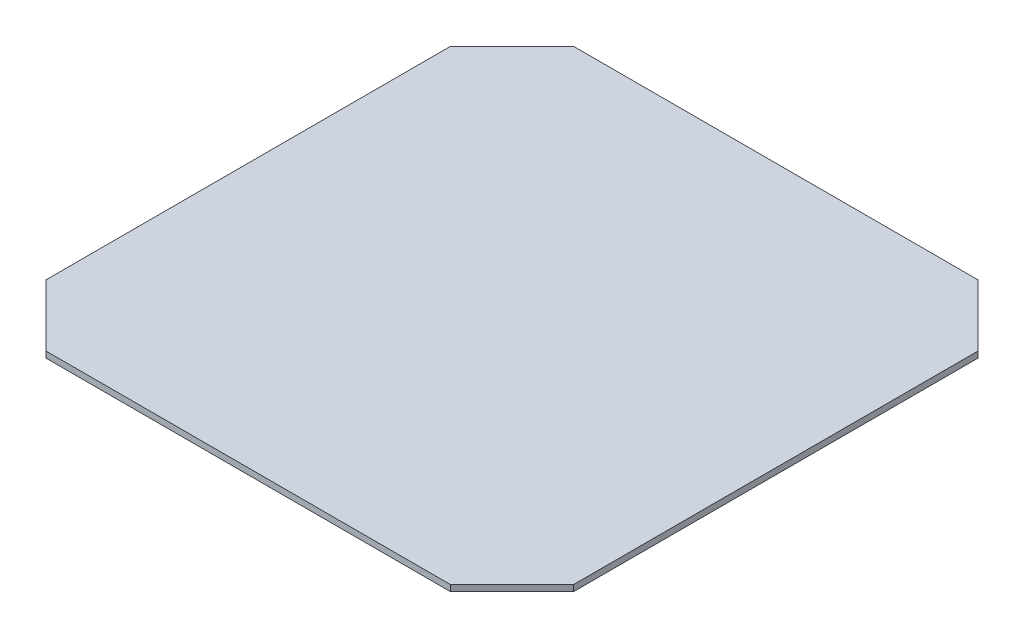
ISO-10303-21;
HEADER;
FILE_DESCRIPTION(('STEP AP214'),'2;1');
FILE_NAME('part.step','',(''),(''),'','','');
FILE_SCHEMA(('AUTOMOTIVE_DESIGN { 1 0 10303 214 1 1 1 1 }'));
ENDSEC;
DATA;
#1=APPLICATION_CONTEXT('core data for automotive mechanical design processes');
#2=APPLICATION_PROTOCOL_DEFINITION('international standard','automotive_design',2000,#1);
#3=PRODUCT_CONTEXT('',#1,'mechanical');
#4=PRODUCT('Part','Part','',(#3));
#5=PRODUCT_RELATED_PRODUCT_CATEGORY('part','',(#4));
#6=PRODUCT_DEFINITION_FORMATION('','',#4);
#7=PRODUCT_DEFINITION_CONTEXT('part definition',#1,'design');
#8=PRODUCT_DEFINITION('design','',#6,#7);
#9=PRODUCT_DEFINITION_SHAPE('','',#8);
#10=(LENGTH_UNIT() NAMED_UNIT(*) SI_UNIT(.MILLI.,.METRE.));
#11=(NAMED_UNIT(*) PLANE_ANGLE_UNIT() SI_UNIT($,.RADIAN.));
#12=(NAMED_UNIT(*) SI_UNIT($,.STERADIAN.) SOLID_ANGLE_UNIT());
#13=UNCERTAINTY_MEASURE_WITH_UNIT(LENGTH_MEASURE(1.E-05),#10,'distance_accuracy_value','');
#14=(GEOMETRIC_REPRESENTATION_CONTEXT(3) GLOBAL_UNCERTAINTY_ASSIGNED_CONTEXT((#13)) GLOBAL_UNIT_ASSIGNED_CONTEXT((#10,
#11,#12)) REPRESENTATION_CONTEXT('',''));
#15=CARTESIAN_POINT('',(0.,0.,0.));
#16=DIRECTION('',(0.,0.,1.));
#17=DIRECTION('',(1.,0.,0.));
#18=AXIS2_PLACEMENT_3D('',#15,#16,#17);
#19=CARTESIAN_POINT('',(0.,1.25,0.));
#20=DIRECTION('',(0.,1.,0.));
#21=DIRECTION('',(0.,0.,1.));
#22=AXIS2_PLACEMENT_3D('',#19,#20,#21);
#23=PLANE('',#22);
#24=DIRECTION('',(0.,0.,1.));
#25=VECTOR('',#24,1.);
#26=CARTESIAN_POINT('',(-107.,1.25,-107.));
#27=LINE('',#26,#25);
#28=CARTESIAN_POINT('',(-107.,1.25,-82.0000000000001));
#29=VERTEX_POINT('',#28);
#30=CARTESIAN_POINT('',(-107.,1.25,81.9999999999998));
#31=VERTEX_POINT('',#30);
#32=EDGE_CURVE('E165',#29,#31,#27,.T.);
#33=ORIENTED_EDGE('',*,*,#32,.T.);
#34=DIRECTION('',(-0.707106781186546,0.,-0.707106781186549));
#35=VECTOR('',#34,1.);
#36=CARTESIAN_POINT('',(-94.5000000000001,1.25,94.4999999999998));
#37=LINE('',#36,#35);
#38=CARTESIAN_POINT('',(-81.9999999999999,1.25,107.));
#39=VERTEX_POINT('',#38);
#40=EDGE_CURVE('E146',#31,#39,#37,.F.);
#41=ORIENTED_EDGE('',*,*,#40,.T.);
#42=DIRECTION('',(1.,0.,0.));
#43=VECTOR('',#42,1.);
#44=CARTESIAN_POINT('',(-107.,1.25,107.));
#45=LINE('',#44,#43);
#46=CARTESIAN_POINT('',(81.9999999999999,1.25,107.));
#47=VERTEX_POINT('',#46);
#48=EDGE_CURVE('E118',#39,#47,#45,.T.);
#49=ORIENTED_EDGE('',*,*,#48,.T.);
#50=DIRECTION('',(-0.707106781186548,0.,0.707106781186547));
#51=VECTOR('',#50,1.);
#52=CARTESIAN_POINT('',(94.4999999999998,1.25,94.5000000000001));
#53=LINE('',#52,#51);
#54=CARTESIAN_POINT('',(107.,1.25,82.));
#55=VERTEX_POINT('',#54);
#56=EDGE_CURVE('E144',#47,#55,#53,.F.);
#57=ORIENTED_EDGE('',*,*,#56,.T.);
#58=DIRECTION('',(0.,0.,-1.));
#59=VECTOR('',#58,1.);
#60=CARTESIAN_POINT('',(107.,1.25,-107.));
#61=LINE('',#60,#59);
#62=CARTESIAN_POINT('',(107.,1.25,-81.9999999999998));
#63=VERTEX_POINT('',#62);
#64=EDGE_CURVE('E124',#55,#63,#61,.T.);
#65=ORIENTED_EDGE('',*,*,#64,.T.);
#66=DIRECTION('',(0.707106781186546,0.,0.707106781186549));
#67=VECTOR('',#66,1.);
#68=CARTESIAN_POINT('',(94.5000000000001,1.25,-94.4999999999998));
#69=LINE('',#68,#67);
#70=CARTESIAN_POINT('',(81.9999999999999,1.25,-107.));
#71=VERTEX_POINT('',#70);
#72=EDGE_CURVE('E53',#63,#71,#69,.F.);
#73=ORIENTED_EDGE('',*,*,#72,.T.);
#74=DIRECTION('',(-1.,0.,0.));
#75=VECTOR('',#74,1.);
#76=CARTESIAN_POINT('',(-107.,1.25,-107.));
#77=LINE('',#76,#75);
#78=CARTESIAN_POINT('',(-82.,1.25,-107.));
#79=VERTEX_POINT('',#78);
#80=EDGE_CURVE('E127',#71,#79,#77,.T.);
#81=ORIENTED_EDGE('',*,*,#80,.T.);
#82=DIRECTION('',(0.707106781186549,0.,-0.707106781186546));
#83=VECTOR('',#82,1.);
#84=CARTESIAN_POINT('',(-94.4999999999999,1.25,-94.5000000000002));
#85=LINE('',#84,#83);
#86=EDGE_CURVE('E141',#79,#29,#85,.F.);
#87=ORIENTED_EDGE('',*,*,#86,.T.);
#88=EDGE_LOOP('',(#33,#41,#49,#57,#65,#73,#81,#87));
#89=FACE_BOUND('',#88,.T.);
#90=ADVANCED_FACE('F32',(#89),#23,.T.);
#91=CARTESIAN_POINT('',(0.,-1.25,0.));
#92=DIRECTION('',(0.,1.,0.));
#93=DIRECTION('',(0.,0.,1.));
#94=AXIS2_PLACEMENT_3D('',#91,#92,#93);
#95=PLANE('',#94);
#96=DIRECTION('',(1.,0.,0.));
#97=VECTOR('',#96,1.);
#98=CARTESIAN_POINT('',(-107.,-1.25,107.));
#99=LINE('',#98,#97);
#100=CARTESIAN_POINT('',(-81.9999999999999,-1.25,107.));
#101=VERTEX_POINT('',#100);
#102=CARTESIAN_POINT('',(81.9999999999999,-1.25,107.));
#103=VERTEX_POINT('',#102);
#104=EDGE_CURVE('E115',#101,#103,#99,.T.);
#105=ORIENTED_EDGE('',*,*,#104,.F.);
#106=DIRECTION('',(0.707106781186546,0.,0.707106781186549));
#107=VECTOR('',#106,1.);
#108=CARTESIAN_POINT('',(-81.9999999999999,-1.25,107.));
#109=LINE('',#108,#107);
#110=CARTESIAN_POINT('',(-107.,-1.25,81.9999999999998));
#111=VERTEX_POINT('',#110);
#112=EDGE_CURVE('E98',#101,#111,#109,.F.);
#113=ORIENTED_EDGE('',*,*,#112,.T.);
#114=DIRECTION('',(0.,0.,1.));
#115=VECTOR('',#114,1.);
#116=CARTESIAN_POINT('',(-107.,-1.25,-107.));
#117=LINE('',#116,#115);
#118=CARTESIAN_POINT('',(-107.,-1.25,-82.0000000000001));
#119=VERTEX_POINT('',#118);
#120=EDGE_CURVE('E125',#119,#111,#117,.T.);
#121=ORIENTED_EDGE('',*,*,#120,.F.);
#122=DIRECTION('',(-0.707106781186549,0.,0.707106781186546));
#123=VECTOR('',#122,1.);
#124=CARTESIAN_POINT('',(-107.,-1.25,-82.0000000000001));
#125=LINE('',#124,#123);
#126=CARTESIAN_POINT('',(-82.,-1.25,-107.));
#127=VERTEX_POINT('',#126);
#128=EDGE_CURVE('E119',#119,#127,#125,.F.);
#129=ORIENTED_EDGE('',*,*,#128,.T.);
#130=DIRECTION('',(-1.,0.,0.));
#131=VECTOR('',#130,1.);
#132=CARTESIAN_POINT('',(-107.,-1.25,-107.));
#133=LINE('',#132,#131);
#134=CARTESIAN_POINT('',(81.9999999999999,-1.25,-107.));
#135=VERTEX_POINT('',#134);
#136=EDGE_CURVE('E129',#135,#127,#133,.T.);
#137=ORIENTED_EDGE('',*,*,#136,.F.);
#138=DIRECTION('',(-0.707106781186546,0.,-0.707106781186549));
#139=VECTOR('',#138,1.);
#140=CARTESIAN_POINT('',(81.9999999999999,-1.25,-107.));
#141=LINE('',#140,#139);
#142=CARTESIAN_POINT('',(107.,-1.25,-81.9999999999998));
#143=VERTEX_POINT('',#142);
#144=EDGE_CURVE('E135',#135,#143,#141,.F.);
#145=ORIENTED_EDGE('',*,*,#144,.T.);
#146=DIRECTION('',(0.,0.,-1.));
#147=VECTOR('',#146,1.);
#148=CARTESIAN_POINT('',(107.,-1.25,-107.));
#149=LINE('',#148,#147);
#150=CARTESIAN_POINT('',(107.,-1.25,82.));
#151=VERTEX_POINT('',#150);
#152=EDGE_CURVE('E157',#151,#143,#149,.T.);
#153=ORIENTED_EDGE('',*,*,#152,.F.);
#154=DIRECTION('',(0.707106781186548,0.,-0.707106781186547));
#155=VECTOR('',#154,1.);
#156=CARTESIAN_POINT('',(107.,-1.25,81.9999999999999));
#157=LINE('',#156,#155);
#158=EDGE_CURVE('E109',#151,#103,#157,.F.);
#159=ORIENTED_EDGE('',*,*,#158,.T.);
#160=EDGE_LOOP('',(#105,#113,#121,#129,#137,#145,#153,#159));
#161=FACE_BOUND('',#160,.T.);
#162=ADVANCED_FACE('F122',(#161),#95,.F.);
#163=CARTESIAN_POINT('',(107.,1.25,-107.));
#164=DIRECTION('',(-1.,0.,0.));
#165=DIRECTION('',(0.,0.,1.));
#166=AXIS2_PLACEMENT_3D('',#163,#164,#165);
#167=PLANE('',#166);
#168=ORIENTED_EDGE('',*,*,#64,.F.);
#169=DIRECTION('',(0.,-1.,0.));
#170=VECTOR('',#169,1.);
#171=CARTESIAN_POINT('',(107.,1.25,81.9999999999999));
#172=LINE('',#171,#170);
#173=EDGE_CURVE('E150',#55,#151,#172,.T.);
#174=ORIENTED_EDGE('',*,*,#173,.T.);
#175=ORIENTED_EDGE('',*,*,#152,.T.);
#176=DIRECTION('',(0.,1.,0.));
#177=VECTOR('',#176,1.);
#178=CARTESIAN_POINT('',(107.,1.25,-81.9999999999998));
#179=LINE('',#178,#177);
#180=EDGE_CURVE('E148',#143,#63,#179,.T.);
#181=ORIENTED_EDGE('',*,*,#180,.T.);
#182=EDGE_LOOP('',(#168,#174,#175,#181));
#183=FACE_BOUND('',#182,.T.);
#184=ADVANCED_FACE('F156',(#183),#167,.F.);
#185=CARTESIAN_POINT('',(-107.,1.25,-107.));
#186=DIRECTION('',(0.,0.,1.));
#187=DIRECTION('',(1.,0.,0.));
#188=AXIS2_PLACEMENT_3D('',#185,#186,#187);
#189=PLANE('',#188);
#190=ORIENTED_EDGE('',*,*,#80,.F.);
#191=DIRECTION('',(0.,-1.,0.));
#192=VECTOR('',#191,1.);
#193=CARTESIAN_POINT('',(81.9999999999999,1.25,-107.));
#194=LINE('',#193,#192);
#195=EDGE_CURVE('E11',#71,#135,#194,.T.);
#196=ORIENTED_EDGE('',*,*,#195,.T.);
#197=ORIENTED_EDGE('',*,*,#136,.T.);
#198=DIRECTION('',(0.,1.,0.));
#199=VECTOR('',#198,1.);
#200=CARTESIAN_POINT('',(-82.,1.25,-107.));
#201=LINE('',#200,#199);
#202=EDGE_CURVE('E40',#127,#79,#201,.T.);
#203=ORIENTED_EDGE('',*,*,#202,.T.);
#204=EDGE_LOOP('',(#190,#196,#197,#203));
#205=FACE_BOUND('',#204,.T.);
#206=ADVANCED_FACE('F175',(#205),#189,.F.);
#207=CARTESIAN_POINT('',(-107.,1.25,-107.));
#208=DIRECTION('',(1.,0.,0.));
#209=DIRECTION('',(0.,0.,-1.));
#210=AXIS2_PLACEMENT_3D('',#207,#208,#209);
#211=PLANE('',#210);
#212=ORIENTED_EDGE('',*,*,#120,.T.);
#213=DIRECTION('',(0.,1.,0.));
#214=VECTOR('',#213,1.);
#215=CARTESIAN_POINT('',(-107.,1.25,81.9999999999998));
#216=LINE('',#215,#214);
#217=EDGE_CURVE('E103',#111,#31,#216,.T.);
#218=ORIENTED_EDGE('',*,*,#217,.T.);
#219=ORIENTED_EDGE('',*,*,#32,.F.);
#220=DIRECTION('',(0.,-1.,0.));
#221=VECTOR('',#220,1.);
#222=CARTESIAN_POINT('',(-107.,1.25,-82.0000000000001));
#223=LINE('',#222,#221);
#224=EDGE_CURVE('E108',#29,#119,#223,.T.);
#225=ORIENTED_EDGE('',*,*,#224,.T.);
#226=EDGE_LOOP('',(#212,#218,#219,#225));
#227=FACE_BOUND('',#226,.T.);
#228=ADVANCED_FACE('F174',(#227),#211,.F.);
#229=CARTESIAN_POINT('',(-107.,1.25,107.));
#230=DIRECTION('',(0.,0.,-1.));
#231=DIRECTION('',(-1.,0.,0.));
#232=AXIS2_PLACEMENT_3D('',#229,#230,#231);
#233=PLANE('',#232);
#234=ORIENTED_EDGE('',*,*,#48,.F.);
#235=DIRECTION('',(0.,-1.,0.));
#236=VECTOR('',#235,1.);
#237=CARTESIAN_POINT('',(-81.9999999999999,1.25,107.));
#238=LINE('',#237,#236);
#239=EDGE_CURVE('E102',#39,#101,#238,.T.);
#240=ORIENTED_EDGE('',*,*,#239,.T.);
#241=ORIENTED_EDGE('',*,*,#104,.T.);
#242=DIRECTION('',(0.,1.,0.));
#243=VECTOR('',#242,1.);
#244=CARTESIAN_POINT('',(81.9999999999999,1.25,107.));
#245=LINE('',#244,#243);
#246=EDGE_CURVE('E120',#103,#47,#245,.T.);
#247=ORIENTED_EDGE('',*,*,#246,.T.);
#248=EDGE_LOOP('',(#234,#240,#241,#247));
#249=FACE_BOUND('',#248,.T.);
#250=ADVANCED_FACE('F114',(#249),#233,.F.);
#251=CARTESIAN_POINT('',(-81.9999999999999,1.25,107.));
#252=DIRECTION('',(0.707106781186549,0.,-0.707106781186546));
#253=DIRECTION('',(0.,-1.,0.));
#254=AXIS2_PLACEMENT_3D('',#251,#252,#253);
#255=PLANE('',#254);
#256=ORIENTED_EDGE('',*,*,#40,.F.);
#257=ORIENTED_EDGE('',*,*,#217,.F.);
#258=ORIENTED_EDGE('',*,*,#112,.F.);
#259=ORIENTED_EDGE('',*,*,#239,.F.);
#260=EDGE_LOOP('',(#256,#257,#258,#259));
#261=FACE_BOUND('',#260,.T.);
#262=ADVANCED_FACE('F101',(#261),#255,.F.);
#263=CARTESIAN_POINT('',(107.,1.25,81.9999999999999));
#264=DIRECTION('',(-0.707106781186546,0.,-0.707106781186548));
#265=DIRECTION('',(0.,-1.,0.));
#266=AXIS2_PLACEMENT_3D('',#263,#264,#265);
#267=PLANE('',#266);
#268=ORIENTED_EDGE('',*,*,#56,.F.);
#269=ORIENTED_EDGE('',*,*,#246,.F.);
#270=ORIENTED_EDGE('',*,*,#158,.F.);
#271=ORIENTED_EDGE('',*,*,#173,.F.);
#272=EDGE_LOOP('',(#268,#269,#270,#271));
#273=FACE_BOUND('',#272,.T.);
#274=ADVANCED_FACE('F178',(#273),#267,.F.);
#275=CARTESIAN_POINT('',(81.9999999999999,1.25,-107.));
#276=DIRECTION('',(-0.707106781186549,0.,0.707106781186546));
#277=DIRECTION('',(0.,-1.,0.));
#278=AXIS2_PLACEMENT_3D('',#275,#276,#277);
#279=PLANE('',#278);
#280=ORIENTED_EDGE('',*,*,#72,.F.);
#281=ORIENTED_EDGE('',*,*,#180,.F.);
#282=ORIENTED_EDGE('',*,*,#144,.F.);
#283=ORIENTED_EDGE('',*,*,#195,.F.);
#284=EDGE_LOOP('',(#280,#281,#282,#283));
#285=FACE_BOUND('',#284,.T.);
#286=ADVANCED_FACE('F177',(#285),#279,.F.);
#287=CARTESIAN_POINT('',(-107.,1.25,-82.0000000000001));
#288=DIRECTION('',(0.707106781186546,0.,0.707106781186549));
#289=DIRECTION('',(0.,-1.,0.));
#290=AXIS2_PLACEMENT_3D('',#287,#288,#289);
#291=PLANE('',#290);
#292=ORIENTED_EDGE('',*,*,#86,.F.);
#293=ORIENTED_EDGE('',*,*,#202,.F.);
#294=ORIENTED_EDGE('',*,*,#128,.F.);
#295=ORIENTED_EDGE('',*,*,#224,.F.);
#296=EDGE_LOOP('',(#292,#293,#294,#295));
#297=FACE_BOUND('',#296,.T.);
#298=ADVANCED_FACE('F34',(#297),#291,.F.);
#299=CLOSED_SHELL('',(#90,#162,#184,#206,#228,#250,#262,#274,#286,#298));
#300=MANIFOLD_SOLID_BREP('B2',#299);
#301=ADVANCED_BREP_SHAPE_REPRESENTATION('',(#18,#300),#14);
#302=SHAPE_DEFINITION_REPRESENTATION(#9,#301);
ENDSEC;
END-ISO-10303-21;
